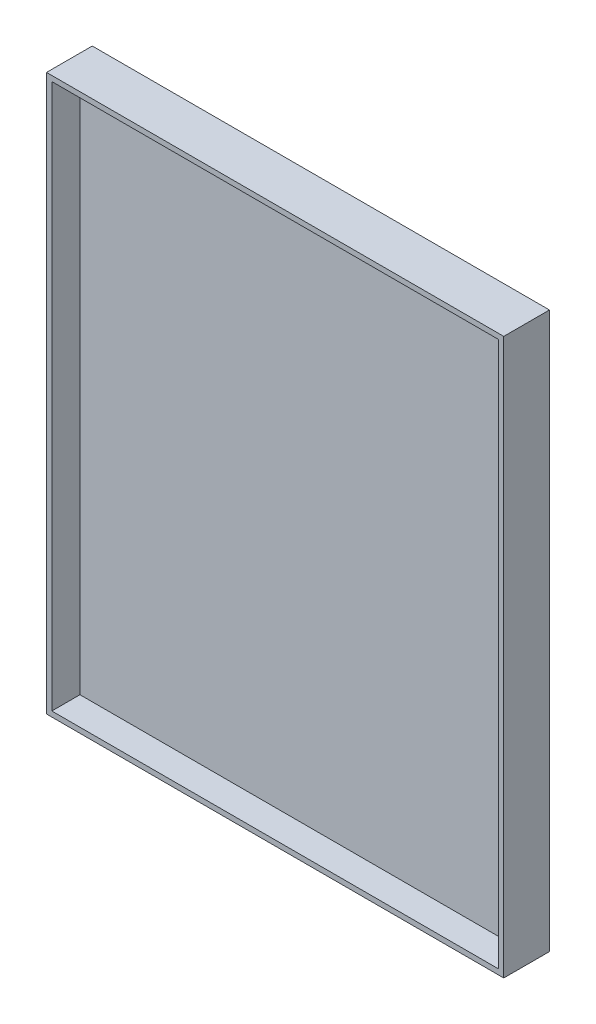
ISO-10303-21;
HEADER;
FILE_DESCRIPTION(('STEP AP214'),'2;1');
FILE_NAME('part.step','',(''),(''),'','','');
FILE_SCHEMA(('AUTOMOTIVE_DESIGN { 1 0 10303 214 1 1 1 1 }'));
ENDSEC;
DATA;
#1=APPLICATION_CONTEXT('core data for automotive mechanical design processes');
#2=APPLICATION_PROTOCOL_DEFINITION('international standard','automotive_design',2000,#1);
#3=PRODUCT_CONTEXT('',#1,'mechanical');
#4=PRODUCT('Part','Part','',(#3));
#5=PRODUCT_RELATED_PRODUCT_CATEGORY('part','',(#4));
#6=PRODUCT_DEFINITION_FORMATION('','',#4);
#7=PRODUCT_DEFINITION_CONTEXT('part definition',#1,'design');
#8=PRODUCT_DEFINITION('design','',#6,#7);
#9=PRODUCT_DEFINITION_SHAPE('','',#8);
#10=(LENGTH_UNIT() NAMED_UNIT(*) SI_UNIT(.MILLI.,.METRE.));
#11=(NAMED_UNIT(*) PLANE_ANGLE_UNIT() SI_UNIT($,.RADIAN.));
#12=(NAMED_UNIT(*) SI_UNIT($,.STERADIAN.) SOLID_ANGLE_UNIT());
#13=UNCERTAINTY_MEASURE_WITH_UNIT(LENGTH_MEASURE(1.E-05),#10,'distance_accuracy_value','');
#14=(GEOMETRIC_REPRESENTATION_CONTEXT(3) GLOBAL_UNCERTAINTY_ASSIGNED_CONTEXT((#13)) GLOBAL_UNIT_ASSIGNED_CONTEXT((#10,
#11,#12)) REPRESENTATION_CONTEXT('',''));
#15=CARTESIAN_POINT('',(0.,0.,0.));
#16=DIRECTION('',(0.,0.,1.));
#17=DIRECTION('',(1.,0.,0.));
#18=AXIS2_PLACEMENT_3D('',#15,#16,#17);
#19=CARTESIAN_POINT('',(65.,-79.,5.));
#20=DIRECTION('',(-1.,0.,0.));
#21=DIRECTION('',(0.,0.,1.));
#22=AXIS2_PLACEMENT_3D('',#19,#20,#21);
#23=PLANE('',#22);
#24=DIRECTION('',(0.,1.,0.));
#25=VECTOR('',#24,1.);
#26=CARTESIAN_POINT('',(65.,-79.,0.));
#27=LINE('',#26,#25);
#28=CARTESIAN_POINT('',(65.,-79.,0.));
#29=VERTEX_POINT('',#28);
#30=CARTESIAN_POINT('',(65.,79.,0.));
#31=VERTEX_POINT('',#30);
#32=EDGE_CURVE('E179',#29,#31,#27,.T.);
#33=ORIENTED_EDGE('',*,*,#32,.T.);
#34=DIRECTION('',(0.,0.,-1.));
#35=VECTOR('',#34,1.);
#36=CARTESIAN_POINT('',(65.,79.,5.));
#37=LINE('',#36,#35);
#38=CARTESIAN_POINT('',(65.,79.,13.));
#39=VERTEX_POINT('',#38);
#40=EDGE_CURVE('E11',#39,#31,#37,.T.);
#41=ORIENTED_EDGE('',*,*,#40,.F.);
#42=DIRECTION('',(0.,1.,0.));
#43=VECTOR('',#42,1.);
#44=CARTESIAN_POINT('',(65.,-79.,13.));
#45=LINE('',#44,#43);
#46=CARTESIAN_POINT('',(65.,-79.,13.));
#47=VERTEX_POINT('',#46);
#48=EDGE_CURVE('E130',#47,#39,#45,.T.);
#49=ORIENTED_EDGE('',*,*,#48,.F.);
#50=DIRECTION('',(0.,0.,-1.));
#51=VECTOR('',#50,1.);
#52=CARTESIAN_POINT('',(65.,-79.,5.));
#53=LINE('',#52,#51);
#54=EDGE_CURVE('E191',#47,#29,#53,.T.);
#55=ORIENTED_EDGE('',*,*,#54,.T.);
#56=EDGE_LOOP('',(#33,#41,#49,#55));
#57=FACE_BOUND('',#56,.T.);
#58=ADVANCED_FACE('F45',(#57),#23,.F.);
#59=CARTESIAN_POINT('',(-65.,79.,5.));
#60=DIRECTION('',(0.,-1.,0.));
#61=DIRECTION('',(0.,0.,-1.));
#62=AXIS2_PLACEMENT_3D('',#59,#60,#61);
#63=PLANE('',#62);
#64=DIRECTION('',(-1.,0.,0.));
#65=VECTOR('',#64,1.);
#66=CARTESIAN_POINT('',(-65.,79.,0.));
#67=LINE('',#66,#65);
#68=CARTESIAN_POINT('',(-65.,79.,0.));
#69=VERTEX_POINT('',#68);
#70=EDGE_CURVE('E183',#31,#69,#67,.T.);
#71=ORIENTED_EDGE('',*,*,#70,.T.);
#72=DIRECTION('',(0.,0.,-1.));
#73=VECTOR('',#72,1.);
#74=CARTESIAN_POINT('',(-65.,79.,5.));
#75=LINE('',#74,#73);
#76=CARTESIAN_POINT('',(-65.,79.,13.));
#77=VERTEX_POINT('',#76);
#78=EDGE_CURVE('E53',#77,#69,#75,.T.);
#79=ORIENTED_EDGE('',*,*,#78,.F.);
#80=DIRECTION('',(-1.,0.,0.));
#81=VECTOR('',#80,1.);
#82=CARTESIAN_POINT('',(-65.,79.,13.));
#83=LINE('',#82,#81);
#84=EDGE_CURVE('E167',#39,#77,#83,.T.);
#85=ORIENTED_EDGE('',*,*,#84,.F.);
#86=ORIENTED_EDGE('',*,*,#40,.T.);
#87=EDGE_LOOP('',(#71,#79,#85,#86));
#88=FACE_BOUND('',#87,.T.);
#89=ADVANCED_FACE('F212',(#88),#63,.F.);
#90=CARTESIAN_POINT('',(-65.,-79.,5.));
#91=DIRECTION('',(1.,0.,0.));
#92=DIRECTION('',(0.,0.,-1.));
#93=AXIS2_PLACEMENT_3D('',#90,#91,#92);
#94=PLANE('',#93);
#95=DIRECTION('',(0.,-1.,0.));
#96=VECTOR('',#95,1.);
#97=CARTESIAN_POINT('',(-65.,-79.,0.));
#98=LINE('',#97,#96);
#99=CARTESIAN_POINT('',(-65.,-79.,0.));
#100=VERTEX_POINT('',#99);
#101=EDGE_CURVE('E186',#69,#100,#98,.T.);
#102=ORIENTED_EDGE('',*,*,#101,.T.);
#103=DIRECTION('',(0.,0.,-1.));
#104=VECTOR('',#103,1.);
#105=CARTESIAN_POINT('',(-65.,-79.,5.));
#106=LINE('',#105,#104);
#107=CARTESIAN_POINT('',(-65.,-79.,13.));
#108=VERTEX_POINT('',#107);
#109=EDGE_CURVE('E194',#108,#100,#106,.T.);
#110=ORIENTED_EDGE('',*,*,#109,.F.);
#111=DIRECTION('',(0.,-1.,0.));
#112=VECTOR('',#111,1.);
#113=CARTESIAN_POINT('',(-65.,-79.,13.));
#114=LINE('',#113,#112);
#115=EDGE_CURVE('E171',#77,#108,#114,.T.);
#116=ORIENTED_EDGE('',*,*,#115,.F.);
#117=ORIENTED_EDGE('',*,*,#78,.T.);
#118=EDGE_LOOP('',(#102,#110,#116,#117));
#119=FACE_BOUND('',#118,.T.);
#120=ADVANCED_FACE('F201',(#119),#94,.F.);
#121=CARTESIAN_POINT('',(-65.,-79.,5.));
#122=DIRECTION('',(0.,1.,0.));
#123=DIRECTION('',(0.,0.,1.));
#124=AXIS2_PLACEMENT_3D('',#121,#122,#123);
#125=PLANE('',#124);
#126=DIRECTION('',(1.,0.,0.));
#127=VECTOR('',#126,1.);
#128=CARTESIAN_POINT('',(-65.,-79.,0.));
#129=LINE('',#128,#127);
#130=EDGE_CURVE('E68',#100,#29,#129,.T.);
#131=ORIENTED_EDGE('',*,*,#130,.T.);
#132=ORIENTED_EDGE('',*,*,#54,.F.);
#133=DIRECTION('',(1.,0.,0.));
#134=VECTOR('',#133,1.);
#135=CARTESIAN_POINT('',(-65.,-79.,13.));
#136=LINE('',#135,#134);
#137=EDGE_CURVE('E175',#108,#47,#136,.T.);
#138=ORIENTED_EDGE('',*,*,#137,.F.);
#139=ORIENTED_EDGE('',*,*,#109,.T.);
#140=EDGE_LOOP('',(#131,#132,#138,#139));
#141=FACE_BOUND('',#140,.T.);
#142=ADVANCED_FACE('F210',(#141),#125,.F.);
#143=CARTESIAN_POINT('',(0.,0.,0.));
#144=DIRECTION('',(0.,0.,-1.));
#145=DIRECTION('',(-1.,0.,0.));
#146=AXIS2_PLACEMENT_3D('',#143,#144,#145);
#147=PLANE('',#146);
#148=ORIENTED_EDGE('',*,*,#32,.F.);
#149=ORIENTED_EDGE('',*,*,#130,.F.);
#150=ORIENTED_EDGE('',*,*,#101,.F.);
#151=ORIENTED_EDGE('',*,*,#70,.F.);
#152=EDGE_LOOP('',(#148,#149,#150,#151));
#153=FACE_BOUND('',#152,.T.);
#154=ADVANCED_FACE('F206',(#153),#147,.T.);
#155=CARTESIAN_POINT('',(0.,0.,13.));
#156=DIRECTION('',(0.,0.,-1.));
#157=DIRECTION('',(-1.,0.,0.));
#158=AXIS2_PLACEMENT_3D('',#155,#156,#157);
#159=PLANE('',#158);
#160=ORIENTED_EDGE('',*,*,#48,.T.);
#161=ORIENTED_EDGE('',*,*,#84,.T.);
#162=ORIENTED_EDGE('',*,*,#115,.T.);
#163=ORIENTED_EDGE('',*,*,#137,.T.);
#164=EDGE_LOOP('',(#160,#161,#162,#163));
#165=FACE_BOUND('',#164,.T.);
#166=DIRECTION('',(0.,1.,0.));
#167=VECTOR('',#166,1.);
#168=CARTESIAN_POINT('',(63.5,-77.5,13.));
#169=LINE('',#168,#167);
#170=CARTESIAN_POINT('',(63.5,-77.5,13.));
#171=VERTEX_POINT('',#170);
#172=CARTESIAN_POINT('',(63.5,77.5,13.));
#173=VERTEX_POINT('',#172);
#174=EDGE_CURVE('E112',#171,#173,#169,.T.);
#175=ORIENTED_EDGE('',*,*,#174,.F.);
#176=DIRECTION('',(1.,0.,0.));
#177=VECTOR('',#176,1.);
#178=CARTESIAN_POINT('',(-63.5,-77.5,13.));
#179=LINE('',#178,#177);
#180=CARTESIAN_POINT('',(-63.5,-77.5,13.));
#181=VERTEX_POINT('',#180);
#182=EDGE_CURVE('E140',#181,#171,#179,.T.);
#183=ORIENTED_EDGE('',*,*,#182,.F.);
#184=DIRECTION('',(0.,-1.,0.));
#185=VECTOR('',#184,1.);
#186=CARTESIAN_POINT('',(-63.5,-77.5,13.));
#187=LINE('',#186,#185);
#188=CARTESIAN_POINT('',(-63.5,77.5,13.));
#189=VERTEX_POINT('',#188);
#190=EDGE_CURVE('E136',#189,#181,#187,.T.);
#191=ORIENTED_EDGE('',*,*,#190,.F.);
#192=DIRECTION('',(-1.,0.,0.));
#193=VECTOR('',#192,1.);
#194=CARTESIAN_POINT('',(-63.5,77.5,13.));
#195=LINE('',#194,#193);
#196=EDGE_CURVE('E121',#173,#189,#195,.T.);
#197=ORIENTED_EDGE('',*,*,#196,.F.);
#198=EDGE_LOOP('',(#175,#183,#191,#197));
#199=FACE_BOUND('',#198,.T.);
#200=ADVANCED_FACE('F134',(#165,#199),#159,.F.);
#201=CARTESIAN_POINT('',(63.5,-77.5,13.));
#202=DIRECTION('',(-1.,0.,0.));
#203=DIRECTION('',(0.,0.,1.));
#204=AXIS2_PLACEMENT_3D('',#201,#202,#203);
#205=PLANE('',#204);
#206=DIRECTION('',(0.,1.,0.));
#207=VECTOR('',#206,1.);
#208=CARTESIAN_POINT('',(63.5,-77.5,5.));
#209=LINE('',#208,#207);
#210=CARTESIAN_POINT('',(63.5,-77.5,5.));
#211=VERTEX_POINT('',#210);
#212=CARTESIAN_POINT('',(63.5,77.5,5.));
#213=VERTEX_POINT('',#212);
#214=EDGE_CURVE('E145',#211,#213,#209,.T.);
#215=ORIENTED_EDGE('',*,*,#214,.F.);
#216=DIRECTION('',(0.,0.,-1.));
#217=VECTOR('',#216,1.);
#218=CARTESIAN_POINT('',(63.5,-77.5,13.));
#219=LINE('',#218,#217);
#220=EDGE_CURVE('E60',#171,#211,#219,.T.);
#221=ORIENTED_EDGE('',*,*,#220,.F.);
#222=ORIENTED_EDGE('',*,*,#174,.T.);
#223=DIRECTION('',(0.,0.,-1.));
#224=VECTOR('',#223,1.);
#225=CARTESIAN_POINT('',(63.5,77.5,13.));
#226=LINE('',#225,#224);
#227=EDGE_CURVE('E115',#173,#213,#226,.T.);
#228=ORIENTED_EDGE('',*,*,#227,.T.);
#229=EDGE_LOOP('',(#215,#221,#222,#228));
#230=FACE_BOUND('',#229,.T.);
#231=ADVANCED_FACE('F114',(#230),#205,.T.);
#232=CARTESIAN_POINT('',(-63.5,77.5,13.));
#233=DIRECTION('',(0.,-1.,0.));
#234=DIRECTION('',(0.,0.,-1.));
#235=AXIS2_PLACEMENT_3D('',#232,#233,#234);
#236=PLANE('',#235);
#237=DIRECTION('',(-1.,0.,0.));
#238=VECTOR('',#237,1.);
#239=CARTESIAN_POINT('',(-63.5,77.5,5.));
#240=LINE('',#239,#238);
#241=CARTESIAN_POINT('',(-63.5,77.5,5.));
#242=VERTEX_POINT('',#241);
#243=EDGE_CURVE('E128',#213,#242,#240,.T.);
#244=ORIENTED_EDGE('',*,*,#243,.F.);
#245=ORIENTED_EDGE('',*,*,#227,.F.);
#246=ORIENTED_EDGE('',*,*,#196,.T.);
#247=DIRECTION('',(0.,0.,-1.));
#248=VECTOR('',#247,1.);
#249=CARTESIAN_POINT('',(-63.5,77.5,13.));
#250=LINE('',#249,#248);
#251=EDGE_CURVE('E131',#189,#242,#250,.T.);
#252=ORIENTED_EDGE('',*,*,#251,.T.);
#253=EDGE_LOOP('',(#244,#245,#246,#252));
#254=FACE_BOUND('',#253,.T.);
#255=ADVANCED_FACE('F125',(#254),#236,.T.);
#256=CARTESIAN_POINT('',(-63.5,-77.5,13.));
#257=DIRECTION('',(1.,0.,0.));
#258=DIRECTION('',(0.,0.,-1.));
#259=AXIS2_PLACEMENT_3D('',#256,#257,#258);
#260=PLANE('',#259);
#261=DIRECTION('',(0.,-1.,0.));
#262=VECTOR('',#261,1.);
#263=CARTESIAN_POINT('',(-63.5,-77.5,5.));
#264=LINE('',#263,#262);
#265=CARTESIAN_POINT('',(-63.5,-77.5,5.));
#266=VERTEX_POINT('',#265);
#267=EDGE_CURVE('E150',#242,#266,#264,.T.);
#268=ORIENTED_EDGE('',*,*,#267,.F.);
#269=ORIENTED_EDGE('',*,*,#251,.F.);
#270=ORIENTED_EDGE('',*,*,#190,.T.);
#271=DIRECTION('',(0.,0.,-1.));
#272=VECTOR('',#271,1.);
#273=CARTESIAN_POINT('',(-63.5,-77.5,13.));
#274=LINE('',#273,#272);
#275=EDGE_CURVE('E159',#181,#266,#274,.T.);
#276=ORIENTED_EDGE('',*,*,#275,.T.);
#277=EDGE_LOOP('',(#268,#269,#270,#276));
#278=FACE_BOUND('',#277,.T.);
#279=ADVANCED_FACE('F235',(#278),#260,.T.);
#280=CARTESIAN_POINT('',(-63.5,-77.5,13.));
#281=DIRECTION('',(0.,1.,0.));
#282=DIRECTION('',(0.,0.,1.));
#283=AXIS2_PLACEMENT_3D('',#280,#281,#282);
#284=PLANE('',#283);
#285=DIRECTION('',(1.,0.,0.));
#286=VECTOR('',#285,1.);
#287=CARTESIAN_POINT('',(-63.5,-77.5,5.));
#288=LINE('',#287,#286);
#289=EDGE_CURVE('E122',#266,#211,#288,.T.);
#290=ORIENTED_EDGE('',*,*,#289,.F.);
#291=ORIENTED_EDGE('',*,*,#275,.F.);
#292=ORIENTED_EDGE('',*,*,#182,.T.);
#293=ORIENTED_EDGE('',*,*,#220,.T.);
#294=EDGE_LOOP('',(#290,#291,#292,#293));
#295=FACE_BOUND('',#294,.T.);
#296=ADVANCED_FACE('F227',(#295),#284,.T.);
#297=CARTESIAN_POINT('',(0.,0.,5.));
#298=DIRECTION('',(0.,0.,-1.));
#299=DIRECTION('',(-1.,0.,0.));
#300=AXIS2_PLACEMENT_3D('',#297,#298,#299);
#301=PLANE('',#300);
#302=ORIENTED_EDGE('',*,*,#289,.T.);
#303=ORIENTED_EDGE('',*,*,#214,.T.);
#304=ORIENTED_EDGE('',*,*,#243,.T.);
#305=ORIENTED_EDGE('',*,*,#267,.T.);
#306=EDGE_LOOP('',(#302,#303,#304,#305));
#307=FACE_BOUND('',#306,.T.);
#308=ADVANCED_FACE('F224',(#307),#301,.F.);
#309=CLOSED_SHELL('',(#58,#89,#120,#142,#154,#200,#231,#255,#279,#296,#308));
#310=MANIFOLD_SOLID_BREP('B2',#309);
#311=ADVANCED_BREP_SHAPE_REPRESENTATION('',(#18,#310),#14);
#312=SHAPE_DEFINITION_REPRESENTATION(#9,#311);
ENDSEC;
END-ISO-10303-21;
